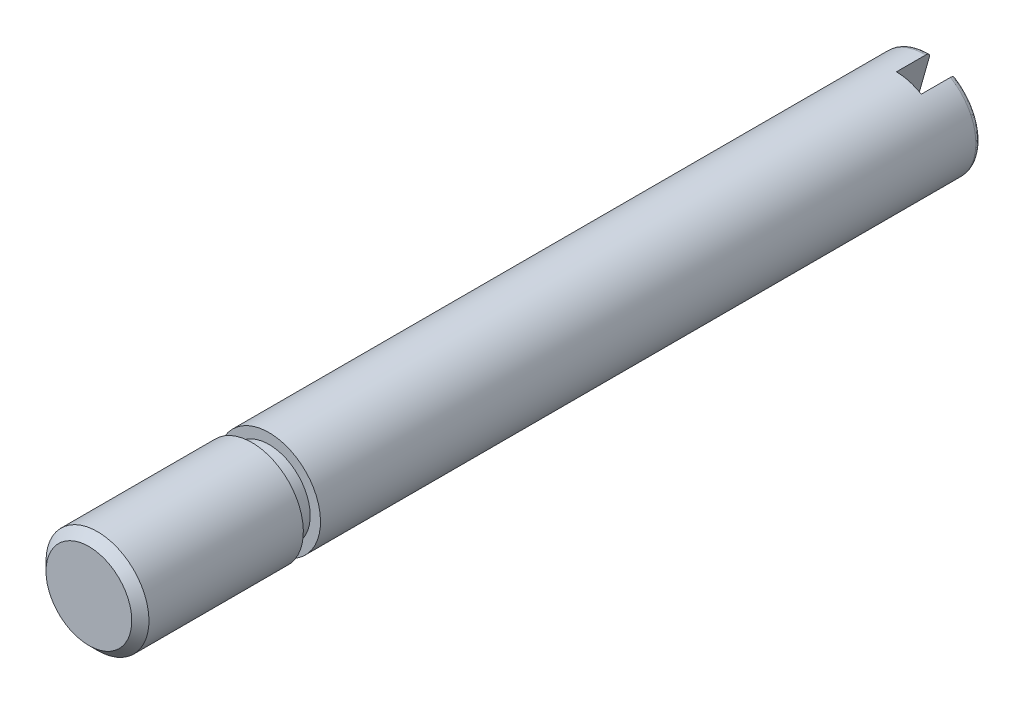
ISO-10303-21;
HEADER;
FILE_DESCRIPTION(('STEP AP214'),'2;1');
FILE_NAME('part.step','',(''),(''),'','','');
FILE_SCHEMA(('AUTOMOTIVE_DESIGN { 1 0 10303 214 1 1 1 1 }'));
ENDSEC;
DATA;
#1=APPLICATION_CONTEXT('core data for automotive mechanical design processes');
#2=APPLICATION_PROTOCOL_DEFINITION('international standard','automotive_design',2000,#1);
#3=PRODUCT_CONTEXT('',#1,'mechanical');
#4=PRODUCT('Part','Part','',(#3));
#5=PRODUCT_RELATED_PRODUCT_CATEGORY('part','',(#4));
#6=PRODUCT_DEFINITION_FORMATION('','',#4);
#7=PRODUCT_DEFINITION_CONTEXT('part definition',#1,'design');
#8=PRODUCT_DEFINITION('design','',#6,#7);
#9=PRODUCT_DEFINITION_SHAPE('','',#8);
#10=(LENGTH_UNIT() NAMED_UNIT(*) SI_UNIT(.MILLI.,.METRE.));
#11=(NAMED_UNIT(*) PLANE_ANGLE_UNIT() SI_UNIT($,.RADIAN.));
#12=(NAMED_UNIT(*) SI_UNIT($,.STERADIAN.) SOLID_ANGLE_UNIT());
#13=UNCERTAINTY_MEASURE_WITH_UNIT(LENGTH_MEASURE(1.E-05),#10,'distance_accuracy_value','');
#14=(GEOMETRIC_REPRESENTATION_CONTEXT(3) GLOBAL_UNCERTAINTY_ASSIGNED_CONTEXT((#13)) GLOBAL_UNIT_ASSIGNED_CONTEXT((#10,
#11,#12)) REPRESENTATION_CONTEXT('',''));
#15=CARTESIAN_POINT('',(0.,0.,0.));
#16=DIRECTION('',(0.,0.,1.));
#17=DIRECTION('',(1.,0.,0.));
#18=AXIS2_PLACEMENT_3D('',#15,#16,#17);
#19=CARTESIAN_POINT('',(14.3275995278251,31.5094332973037,1.3));
#20=CARTESIAN_POINT('',(13.9351903412547,30.1307446996921,1.3));
#21=CARTESIAN_POINT('',(14.4744906158238,28.8026172838396,1.3));
#22=CARTESIAN_POINT('',(15.7169898798209,28.087800665499,1.3));
#23=CARTESIAN_POINT('',(14.327599527825,31.5094332973037,1.12426406871192));
#24=CARTESIAN_POINT('',(13.9351903412547,30.130744699692,1.12426406871192));
#25=CARTESIAN_POINT('',(14.4744906158238,28.8026172838395,1.12426406871192));
#26=CARTESIAN_POINT('',(15.7169898798209,28.087800665499,1.12426406871192));
#27=CARTESIAN_POINT('',(14.4471167357505,31.4754157168114,0.999999999999985));
#28=CARTESIAN_POINT('',(14.0709616698879,30.1538342707417,0.999999999999985));
#29=CARTESIAN_POINT('',(14.5879233956651,28.8807196937097,0.999999999999985));
#30=CARTESIAN_POINT('',(15.7789566550236,28.1955117491618,0.999999999999985));
#31=CARTESIAN_POINT('',(14.6161395921356,31.42730759312,1.));
#32=CARTESIAN_POINT('',(14.2629713242223,30.1864878552694,0.999999999999993));
#33=CARTESIAN_POINT('',(14.7483415713344,28.9911731810022,0.999999999999993));
#34=CARTESIAN_POINT('',(15.8665909089318,28.3478382244957,1.));
#35=(BOUNDED_SURFACE() B_SPLINE_SURFACE(3,3,((#19,#20,#21,#22),(#23,#24,#25,#26),(#27,#28,#29,
#30),(#31,#32,#33,#34)),.UNSPECIFIED.,.F.,.F.,.F.) B_SPLINE_SURFACE_WITH_KNOTS((4,4),(4,4),(0.,
1.),(0.,1.),.UNSPECIFIED.) GEOMETRIC_REPRESENTATION_ITEM() RATIONAL_B_SPLINE_SURFACE(((1.,
0.858761137665014,0.858761137665014,1.),(0.804737854124366,0.691077595129943,0.691077595129943,
0.804737854124366),(0.804737854124366,0.691077595129943,0.691077595129943,0.804737854124366),
(1.,0.858761137665014,0.858761137665014,1.))) REPRESENTATION_ITEM('') SURFACE());
#36=CARTESIAN_POINT('',(17.2130001709302,30.6881762554658,1.3));
#37=DIRECTION('',(0.,0.,1.));
#38=DIRECTION('',(-0.961800214368381,0.273752347279319,0.));
#39=AXIS2_PLACEMENT_3D('',#36,#37,#38);
#40=CIRCLE('',#39,3.);
#41=CARTESIAN_POINT('',(14.327599527825,31.5094332973037,1.3));
#42=VERTEX_POINT('',#41);
#43=CARTESIAN_POINT('',(15.6964712986554,28.0997133564547,1.3));
#44=VERTEX_POINT('',#43);
#45=EDGE_CURVE('E11',#42,#44,#40,.T.);
#46=CARTESIAN_POINT('',(14.6161395921356,31.42730759312,1.3));
#47=DIRECTION('',(-0.273752347279324,-0.96180021436838,0.));
#48=DIRECTION('',(-0.96180021436838,0.273752347279323,0.));
#49=AXIS2_PLACEMENT_3D('',#46,#47,#48);
#50=CIRCLE('',#49,0.3);
#51=CARTESIAN_POINT('',(14.6161395921356,31.42730759312,1.));
#52=VERTEX_POINT('',#51);
#53=EDGE_CURVE('E138',#42,#52,#50,.T.);
#54=CARTESIAN_POINT('',(14.6161395921356,31.42730759312,1.));
#55=CARTESIAN_POINT('',(14.274293320927,30.2262665054469,1.));
#56=CARTESIAN_POINT('',(14.7227896712529,29.0608440107428,1.));
#57=CARTESIAN_POINT('',(15.7816069207893,28.3988284523893,1.));
#58=(BOUNDED_CURVE() B_SPLINE_CURVE(3,(#54,#55,#56,#57),.UNSPECIFIED.,.F.,
.F.) B_SPLINE_CURVE_WITH_KNOTS((4,4),(0.5,1.),
.UNSPECIFIED.) CURVE() GEOMETRIC_REPRESENTATION_ITEM() RATIONAL_B_SPLINE_CURVE((1.,
0.866203502590302,0.866203502590302,1.)) REPRESENTATION_ITEM(''));
#59=CARTESIAN_POINT('',(15.7816069207893,28.3988284523893,1.));
#60=VERTEX_POINT('',#59);
#61=EDGE_CURVE('E135',#52,#60,#58,.T.);
#62=CARTESIAN_POINT('',(15.7816069207893,28.3988284523893,1.));
#63=CARTESIAN_POINT('',(15.7806739513126,28.3955505889798,0.999999975549372));
#64=CARTESIAN_POINT('',(15.779736963955,28.3922738655346,1.0000535924963));
#65=CARTESIAN_POINT('',(15.7778661153499,28.3857564892972,1.00026724492291));
#66=CARTESIAN_POINT('',(15.7769323080403,28.3825157879103,1.00042627140245));
#67=CARTESIAN_POINT('',(15.7750711594981,28.3760764329799,1.00084764695042));
#68=CARTESIAN_POINT('',(15.7741438540253,28.3728776966133,1.00110888792764));
#69=CARTESIAN_POINT('',(15.7722988652095,28.3665280215372,1.00173103036324));
#70=CARTESIAN_POINT('',(15.7713811960235,28.3633769610159,1.00209073181243));
#71=CARTESIAN_POINT('',(15.7695584265132,28.3571280521949,1.00290566856719));
#72=CARTESIAN_POINT('',(15.7686533159423,28.3540300397627,1.0033596193892));
#73=CARTESIAN_POINT('',(15.7668584388943,28.3478924907782,1.00435843578288));
#74=CARTESIAN_POINT('',(15.7659686348125,28.3448527422397,1.00490194153651));
#75=CARTESIAN_POINT('',(15.7633469811428,28.3358999815334,1.00664746148284));
#76=CARTESIAN_POINT('',(15.7616211415771,28.3300106776378,1.00798326210272));
#77=CARTESIAN_POINT('',(15.7582584476163,28.318519913428,1.01096091090899));
#78=CARTESIAN_POINT('',(15.7566205842944,28.3129155593046,1.01259052056934));
#79=CARTESIAN_POINT('',(15.7534468980072,28.3020216035975,1.01610860228836));
#80=CARTESIAN_POINT('',(15.7519095996854,28.2967283123653,1.01798431006652));
#81=CARTESIAN_POINT('',(15.7489461873004,28.2864773246064,1.02194499013394));
#82=CARTESIAN_POINT('',(15.7475181666997,28.2815151598697,1.02401698118146));
#83=CARTESIAN_POINT('',(15.7447784676268,28.2719405165659,1.02831992765366));
#84=CARTESIAN_POINT('',(15.743464527409,28.2673228767809,1.03053796398403));
#85=CARTESIAN_POINT('',(15.7409545554435,28.2584452577589,1.03508337158106));
#86=CARTESIAN_POINT('',(15.7397560052497,28.2541795292839,1.03739812948116));
#87=CARTESIAN_POINT('',(15.7374752052448,28.2460081775351,1.04208920521931));
#88=CARTESIAN_POINT('',(15.7363902988765,28.2420963412999,1.04445341463916));
#89=CARTESIAN_POINT('',(15.7343325383685,28.2346304744177,1.04919838519865));
#90=CARTESIAN_POINT('',(15.7333570203152,28.2310698974215,1.05156769579987));
#91=CARTESIAN_POINT('',(15.7315116064823,28.2243003967519,1.05628129551688));
#92=CARTESIAN_POINT('',(15.7306391858849,28.2210847175099,1.05861489863373));
#93=CARTESIAN_POINT('',(15.7289921428727,28.2149957789976,1.06321932695368));
#94=CARTESIAN_POINT('',(15.7282152722382,28.2121156741087,1.06548029787352));
#95=CARTESIAN_POINT('',(15.7267497564522,28.2066868046289,1.06990583572401));
#96=CARTESIAN_POINT('',(15.7260593596351,28.2041311714747,1.07206140156628));
#97=CARTESIAN_POINT('',(15.7247587050448,28.1993379014812,1.07624630023692));
#98=CARTESIAN_POINT('',(15.7241471859581,28.1970935186153,1.07826750801592));
#99=CARTESIAN_POINT('',(15.7229890548223,28.1929118273929,1.08215872230218));
#100=CARTESIAN_POINT('',(15.7224425940486,28.190967608912,1.08402136231459));
#101=CARTESIAN_POINT('',(15.7208680125472,28.1854157244331,1.08949356132704));
#102=CARTESIAN_POINT('',(15.7198464708276,28.1818764060687,1.09317479643281));
#103=CARTESIAN_POINT('',(15.7178593112723,28.1749842442447,1.10072119688608));
#104=CARTESIAN_POINT('',(15.7168936880198,28.171631382724,1.10458634435135));
#105=CARTESIAN_POINT('',(15.715016028566,28.1651282970348,1.11248755749003));
#106=CARTESIAN_POINT('',(15.7141039255336,28.1619778196602,1.11652339868565));
#107=CARTESIAN_POINT('',(15.7123410764134,28.1558900313645,1.12474977000038));
#108=CARTESIAN_POINT('',(15.7114901845584,28.1529522139069,1.12893989409049));
#109=CARTESIAN_POINT('',(15.7098537798084,28.1472999441527,1.13745788237911));
#110=CARTESIAN_POINT('',(15.7090680390831,28.1445847138924,1.14178518648546));
#111=CARTESIAN_POINT('',(15.7075658447791,28.1393859018291,1.15055948438418));
#112=CARTESIAN_POINT('',(15.7068490737431,28.1369012607419,1.15500579616164));
#113=CARTESIAN_POINT('',(15.7054875869309,28.1321702953796,1.16399936927883));
#114=CARTESIAN_POINT('',(15.704842462889,28.1299226249404,1.16854586062327));
#115=CARTESIAN_POINT('',(15.7036261413333,28.1256704945771,1.17772057674804));
#116=CARTESIAN_POINT('',(15.7030544456596,28.1236644022347,1.18234797887762));
#117=CARTESIAN_POINT('',(15.7019858838606,28.1198985550817,1.19166509592119));
#118=CARTESIAN_POINT('',(15.7014884341495,28.1181368877245,1.19635397083938));
#119=CARTESIAN_POINT('',(15.7005683347952,28.1148612584183,1.20577466023028));
#120=CARTESIAN_POINT('',(15.7001450234409,28.1133451153553,1.21050565165603));
#121=CARTESIAN_POINT('',(15.6993722684342,28.11056019343,1.21999149289481));
#122=CARTESIAN_POINT('',(15.6990220949277,28.1092889813693,1.22474556887019));
#123=CARTESIAN_POINT('',(15.698393830271,28.1069919477784,1.23425901618843));
#124=CARTESIAN_POINT('',(15.6981149533542,28.1059634618091,1.23901769229128));
#125=CARTESIAN_POINT('',(15.6976267098402,28.1041483809549,1.24852250062447));
#126=CARTESIAN_POINT('',(15.6974165155427,28.1033589148507,1.25326804202533));
#127=CARTESIAN_POINT('',(15.6970623379982,28.1020169646595,1.2627296405014));
#128=CARTESIAN_POINT('',(15.6969175005685,28.1014614300359,1.26744523295149));
#129=CARTESIAN_POINT('',(15.6966901432559,28.1005812012751,1.27683105594817));
#130=CARTESIAN_POINT('',(15.6966067582321,28.1002533063526,1.28150096529322));
#131=CARTESIAN_POINT('',(15.6964977164326,28.0998210109607,1.29078067793812));
#132=CARTESIAN_POINT('',(15.6964712021069,28.0997132916635,1.29539031688364));
#133=CARTESIAN_POINT('',(15.6964712986554,28.0997133564547,1.3));
#134=B_SPLINE_CURVE_WITH_KNOTS('',3,(#62,#63,#64,#65,#66,#67,#68,#69,#70,#71,#72,#73,#74,#75,
#76,#77,#78,#79,#80,#81,#82,#83,#84,#85,#86,#87,#88,#89,#90,#91,#92,#93,#94,#95,#96,#97,#98,#99,
#100,#101,#102,#103,#104,#105,#106,#107,#108,#109,#110,#111,#112,#113,#114,#115,#116,#117,#118,
#119,#120,#121,#122,#123,#124,#125,#126,#127,#128,#129,#130,#131,#132,#133),.UNSPECIFIED.,.F.,
.F.,(4,2,2,2,2,2,2,2,2,2,2,2,2,2,2,2,2,2,2,2,2,2,2,2,2,2,2,2,2,2,2,2,2,2,2,4),(0.,
0.0102237352366994,0.0203509935103454,0.0303713771356298,0.0402746908777026,0.0500509853615911,
0.0596905969140439,0.0785207224399316,0.0966969585577286,0.114155391983707,0.130839033239317,
0.146698050819379,0.161689752206389,0.175778348185342,0.188934543814742,0.201135002199291,
0.212361726797937,0.222601405661014,0.231844758369286,0.240085925890713,0.255701874666598,
0.271316308157883,0.286910809598573,0.30246685289533,0.317965976395117,0.333389954944088,
0.348720967064951,0.363941754266164,0.37903576978509,0.393987314441675,0.408781657718994,
0.423405142668291,0.437845273735379,0.452090787097925,0.466131703568946,0.479959364542045),.UNSPECIFIED.);
#135=EDGE_CURVE('E193',#44,#60,#134,.F.);
#136=ORIENTED_EDGE('',*,*,#45,.F.);
#137=ORIENTED_EDGE('',*,*,#53,.T.);
#138=ORIENTED_EDGE('',*,*,#61,.T.);
#139=ORIENTED_EDGE('',*,*,#135,.F.);
#140=EDGE_LOOP('',(#136,#137,#138,#139));
#141=FACE_BOUND('',#140,.T.);
#142=ADVANCED_FACE('F17',(#141),#35,.T.);
#143=CARTESIAN_POINT('',(17.2130001709302,30.6881762554658,49.5));
#144=DIRECTION('',(0.,0.,-1.));
#145=DIRECTION('',(0.961800214368381,-0.27375234727932,0.));
#146=AXIS2_PLACEMENT_3D('',#143,#144,#145);
#147=CYLINDRICAL_SURFACE('',#146,3.);
#148=CARTESIAN_POINT('',(17.2130001709302,30.6881762554658,1.3));
#149=DIRECTION('',(0.,0.,-1.));
#150=DIRECTION('',(-0.961800214368381,0.273752347279319,0.));
#151=AXIS2_PLACEMENT_3D('',#148,#149,#150);
#152=CIRCLE('',#151,3.);
#153=CARTESIAN_POINT('',(18.729529043205,33.2766391544769,1.3));
#154=VERTEX_POINT('',#153);
#155=CARTESIAN_POINT('',(17.139171620208,27.6890848355357,1.3));
#156=VERTEX_POINT('',#155);
#157=EDGE_CURVE('E278',#154,#156,#152,.T.);
#158=ORIENTED_EDGE('',*,*,#157,.F.);
#159=DIRECTION('',(0.,0.,1.));
#160=VECTOR('',#159,1.);
#161=CARTESIAN_POINT('',(18.729529043205,33.2766391544769,50.));
#162=LINE('',#161,#160);
#163=CARTESIAN_POINT('',(18.729529043205,33.2766391544769,3.));
#164=VERTEX_POINT('',#163);
#165=EDGE_CURVE('E261',#154,#164,#162,.T.);
#166=ORIENTED_EDGE('',*,*,#165,.T.);
#167=CARTESIAN_POINT('',(17.2130001709302,30.6881762554658,3.));
#168=DIRECTION('',(0.,0.,-1.));
#169=DIRECTION('',(0.96180021436838,-0.27375234727932,0.));
#170=AXIS2_PLACEMENT_3D('',#167,#168,#169);
#171=CIRCLE('',#170,3.);
#172=CARTESIAN_POINT('',(17.2868287216524,33.6872676753959,3.));
#173=VERTEX_POINT('',#172);
#174=EDGE_CURVE('E334',#173,#164,#171,.T.);
#175=ORIENTED_EDGE('',*,*,#174,.F.);
#176=DIRECTION('',(0.,0.,1.));
#177=VECTOR('',#176,1.);
#178=CARTESIAN_POINT('',(17.2868287216524,33.6872676753959,1.));
#179=LINE('',#178,#177);
#180=CARTESIAN_POINT('',(17.2868287216524,33.6872676753959,1.3));
#181=VERTEX_POINT('',#180);
#182=EDGE_CURVE('E208',#181,#173,#179,.T.);
#183=ORIENTED_EDGE('',*,*,#182,.F.);
#184=CARTESIAN_POINT('',(17.2130001709302,30.6881762554658,1.3));
#185=DIRECTION('',(0.,0.,1.));
#186=DIRECTION('',(-0.96180021436838,0.273752347279321,0.));
#187=AXIS2_PLACEMENT_3D('',#184,#185,#186);
#188=CIRCLE('',#187,3.);
#189=EDGE_CURVE('E342',#181,#42,#188,.T.);
#190=ORIENTED_EDGE('',*,*,#189,.T.);
#191=ORIENTED_EDGE('',*,*,#45,.T.);
#192=DIRECTION('',(0.,0.,-1.));
#193=VECTOR('',#192,1.);
#194=CARTESIAN_POINT('',(15.6964712986554,28.0997133564547,1.));
#195=LINE('',#194,#193);
#196=CARTESIAN_POINT('',(15.6964712986554,28.0997133564547,3.));
#197=VERTEX_POINT('',#196);
#198=EDGE_CURVE('E204',#197,#44,#195,.T.);
#199=ORIENTED_EDGE('',*,*,#198,.F.);
#200=CARTESIAN_POINT('',(17.2130001709302,30.6881762554658,3.));
#201=DIRECTION('',(0.,0.,-1.));
#202=DIRECTION('',(0.96180021436838,-0.27375234727932,0.));
#203=AXIS2_PLACEMENT_3D('',#200,#201,#202);
#204=CIRCLE('',#203,3.);
#205=CARTESIAN_POINT('',(17.139171620208,27.6890848355357,3.));
#206=VERTEX_POINT('',#205);
#207=EDGE_CURVE('E320',#206,#197,#204,.T.);
#208=ORIENTED_EDGE('',*,*,#207,.F.);
#209=DIRECTION('',(0.,0.,-1.));
#210=VECTOR('',#209,1.);
#211=CARTESIAN_POINT('',(17.139171620208,27.6890848355357,50.));
#212=LINE('',#211,#210);
#213=EDGE_CURVE('E269',#206,#156,#212,.T.);
#214=ORIENTED_EDGE('',*,*,#213,.T.);
#215=EDGE_LOOP('',(#158,#166,#175,#183,#190,#191,#199,#208,#214));
#216=FACE_BOUND('',#215,.T.);
#217=CARTESIAN_POINT('',(17.2130001709302,30.6881762554658,39.5000000033493));
#218=DIRECTION('',(0.,0.,1.));
#219=DIRECTION('',(-0.961800214368381,0.273752347279319,0.));
#220=AXIS2_PLACEMENT_3D('',#217,#218,#219);
#221=CIRCLE('',#220,3.);
#222=CARTESIAN_POINT('',(14.3275995278251,31.5094332973037,39.5000000033493));
#223=VERTEX_POINT('',#222);
#224=EDGE_CURVE('E126',#223,#223,#221,.T.);
#225=ORIENTED_EDGE('',*,*,#224,.F.);
#226=EDGE_LOOP('',(#225));
#227=FACE_BOUND('',#226,.T.);
#228=ADVANCED_FACE('F19',(#216,#227),#147,.T.);
#229=CARTESIAN_POINT('',(17.2130001709302,30.6881762554658,49.5));
#230=DIRECTION('',(0.,0.,1.));
#231=DIRECTION('',(-0.96180021436838,0.27375234727932,0.));
#232=AXIS2_PLACEMENT_3D('',#229,#230,#231);
#233=CYLINDRICAL_SURFACE('',#232,2.4);
#234=CARTESIAN_POINT('',(17.2130001709302,30.6881762554658,40.5000000033493));
#235=DIRECTION('',(0.,0.,1.));
#236=DIRECTION('',(-0.96180021436838,0.27375234727932,0.));
#237=AXIS2_PLACEMENT_3D('',#234,#235,#236);
#238=CIRCLE('',#237,2.4);
#239=CARTESIAN_POINT('',(14.9046796564461,31.3451818889361,40.5000000033493));
#240=VERTEX_POINT('',#239);
#241=EDGE_CURVE('E133',#240,#240,#238,.T.);
#242=ORIENTED_EDGE('',*,*,#241,.F.);
#243=EDGE_LOOP('',(#242));
#244=FACE_BOUND('',#243,.T.);
#245=CARTESIAN_POINT('',(17.2130001709302,30.6881762554658,39.5000000033493));
#246=DIRECTION('',(0.,0.,1.));
#247=DIRECTION('',(-0.96180021436838,0.27375234727932,0.));
#248=AXIS2_PLACEMENT_3D('',#245,#246,#247);
#249=CIRCLE('',#248,2.4);
#250=CARTESIAN_POINT('',(14.9046796564461,31.3451818889361,39.5000000033493));
#251=VERTEX_POINT('',#250);
#252=EDGE_CURVE('E121',#251,#251,#249,.T.);
#253=ORIENTED_EDGE('',*,*,#252,.T.);
#254=EDGE_LOOP('',(#253));
#255=FACE_BOUND('',#254,.T.);
#256=ADVANCED_FACE('F122',(#244,#255),#233,.T.);
#257=CARTESIAN_POINT('',(17.2130001709302,30.6881762554658,50.0000000033494));
#258=DIRECTION('',(0.,0.,-1.));
#259=DIRECTION('',(0.273752347279319,0.961800214368381,0.));
#260=AXIS2_PLACEMENT_3D('',#257,#258,#259);
#261=CONICAL_SURFACE('',#260,2.50000000334937,0.78539815);
#262=CARTESIAN_POINT('',(17.2130001709302,30.6881762554658,50.0000000033494));
#263=DIRECTION('',(0.,0.,-1.));
#264=DIRECTION('',(0.273752347279319,0.961800214368381,0.));
#265=AXIS2_PLACEMENT_3D('',#262,#263,#264);
#266=CIRCLE('',#265,2.50000000334937);
#267=CARTESIAN_POINT('',(17.8973810400454,33.0926767946081,50.0000000033494));
#268=VERTEX_POINT('',#267);
#269=EDGE_CURVE('E46',#268,#268,#266,.T.);
#270=ORIENTED_EDGE('',*,*,#269,.T.);
#271=EDGE_LOOP('',(#270));
#272=FACE_BOUND('',#271,.T.);
#273=CARTESIAN_POINT('',(17.2130001709302,30.6881762554658,49.5));
#274=DIRECTION('',(0.,0.,-1.));
#275=DIRECTION('',(-0.961800214368381,0.273752347279319,0.));
#276=AXIS2_PLACEMENT_3D('',#273,#274,#275);
#277=CIRCLE('',#276,3.);
#278=CARTESIAN_POINT('',(14.3275995278251,31.5094332973037,49.5));
#279=VERTEX_POINT('',#278);
#280=EDGE_CURVE('E27',#279,#279,#277,.T.);
#281=ORIENTED_EDGE('',*,*,#280,.F.);
#282=EDGE_LOOP('',(#281));
#283=FACE_BOUND('',#282,.T.);
#284=ADVANCED_FACE('F399',(#272,#283),#261,.T.);
#285=CARTESIAN_POINT('',(17.2130001709302,30.6881762554658,49.5));
#286=DIRECTION('',(0.,0.,-1.));
#287=DIRECTION('',(0.961800214368381,-0.27375234727932,0.));
#288=AXIS2_PLACEMENT_3D('',#285,#286,#287);
#289=CYLINDRICAL_SURFACE('',#288,3.);
#290=CARTESIAN_POINT('',(17.2130001709302,30.6881762554658,40.5000000033493));
#291=DIRECTION('',(0.,0.,1.));
#292=DIRECTION('',(-0.961800214368381,0.273752347279319,0.));
#293=AXIS2_PLACEMENT_3D('',#290,#291,#292);
#294=CIRCLE('',#293,3.);
#295=CARTESIAN_POINT('',(14.3275995278251,31.5094332973037,40.5000000033493));
#296=VERTEX_POINT('',#295);
#297=EDGE_CURVE('E125',#296,#296,#294,.T.);
#298=ORIENTED_EDGE('',*,*,#297,.T.);
#299=EDGE_LOOP('',(#298));
#300=FACE_BOUND('',#299,.T.);
#301=ORIENTED_EDGE('',*,*,#280,.T.);
#302=EDGE_LOOP('',(#301));
#303=FACE_BOUND('',#302,.T.);
#304=ADVANCED_FACE('F402',(#300,#303),#289,.T.);
#305=CARTESIAN_POINT('',(17.2130001709302,30.6881762554658,50.));
#306=DIRECTION('',(0.,0.,1.));
#307=DIRECTION('',(0.,-1.,0.));
#308=AXIS2_PLACEMENT_3D('',#305,#306,#307);
#309=PLANE('',#308);
#310=ORIENTED_EDGE('',*,*,#269,.F.);
#311=EDGE_LOOP('',(#310));
#312=FACE_BOUND('',#311,.T.);
#313=ADVANCED_FACE('F403',(#312),#309,.T.);
#314=CARTESIAN_POINT('',(20.0984008140353,29.8669192136278,40.5000000033493));
#315=DIRECTION('',(0.,0.,-1.));
#316=DIRECTION('',(0.,-1.,0.));
#317=AXIS2_PLACEMENT_3D('',#314,#315,#316);
#318=PLANE('',#317);
#319=ORIENTED_EDGE('',*,*,#241,.T.);
#320=EDGE_LOOP('',(#319));
#321=FACE_BOUND('',#320,.T.);
#322=ORIENTED_EDGE('',*,*,#297,.F.);
#323=EDGE_LOOP('',(#322));
#324=FACE_BOUND('',#323,.T.);
#325=ADVANCED_FACE('F398',(#321,#324),#318,.T.);
#326=CARTESIAN_POINT('',(19.5213206854143,30.0311706219955,39.5000000033493));
#327=DIRECTION('',(0.,0.,1.));
#328=DIRECTION('',(0.,-1.,0.));
#329=AXIS2_PLACEMENT_3D('',#326,#327,#328);
#330=PLANE('',#329);
#331=ORIENTED_EDGE('',*,*,#252,.F.);
#332=EDGE_LOOP('',(#331));
#333=FACE_BOUND('',#332,.T.);
#334=ORIENTED_EDGE('',*,*,#224,.T.);
#335=EDGE_LOOP('',(#334));
#336=FACE_BOUND('',#335,.T.);
#337=ADVANCED_FACE('F394',(#333,#336),#330,.T.);
#338=CARTESIAN_POINT('',(17.2130001709302,30.6881762554658,1.));
#339=DIRECTION('',(0.,0.,-1.));
#340=DIRECTION('',(0.,-1.,0.));
#341=AXIS2_PLACEMENT_3D('',#338,#339,#340);
#342=PLANE('',#341);
#343=CARTESIAN_POINT('',(17.2016930995185,33.3881525794612,1.));
#344=CARTESIAN_POINT('',(15.9529612548662,33.3829230891076,0.999999999999993));
#345=CARTESIAN_POINT('',(14.9579858633441,32.628348680793,0.999999999999993));
#346=CARTESIAN_POINT('',(14.6161395921356,31.42730759312,1.));
#347=(BOUNDED_CURVE() B_SPLINE_CURVE(3,(#343,#344,#345,#346),.UNSPECIFIED.,.F.,
.F.) B_SPLINE_CURVE_WITH_KNOTS((4,4),(0.,0.5),
.UNSPECIFIED.) CURVE() GEOMETRIC_REPRESENTATION_ITEM() RATIONAL_B_SPLINE_CURVE((1.,
0.866203502590302,0.866203502590302,1.)) REPRESENTATION_ITEM(''));
#348=CARTESIAN_POINT('',(17.2016930995185,33.3881525794612,1.));
#349=VERTEX_POINT('',#348);
#350=EDGE_CURVE('E213',#349,#52,#347,.T.);
#351=ORIENTED_EDGE('',*,*,#350,.F.);
#352=DIRECTION('',(-0.27375234727932,-0.961800214368381,0.));
#353=VECTOR('',#352,1.);
#354=CARTESIAN_POINT('',(16.4916500101539,30.8934905159253,1.));
#355=LINE('',#354,#353);
#356=EDGE_CURVE('E349',#349,#60,#355,.T.);
#357=ORIENTED_EDGE('',*,*,#356,.T.);
#358=ORIENTED_EDGE('',*,*,#61,.F.);
#359=EDGE_LOOP('',(#351,#357,#358));
#360=FACE_BOUND('',#359,.T.);
#361=ADVANCED_FACE('F391',(#360),#342,.T.);
#362=CARTESIAN_POINT('',(17.2130001709302,30.6881762554658,1.));
#363=DIRECTION('',(0.,0.,-1.));
#364=DIRECTION('',(0.,-1.,0.));
#365=AXIS2_PLACEMENT_3D('',#362,#363,#364);
#366=PLANE('',#365);
#367=CARTESIAN_POINT('',(17.2243072423419,27.9881999314703,1.));
#368=CARTESIAN_POINT('',(20.5590897467165,28.002165470199,0.999999999999992));
#369=CARTESIAN_POINT('',(21.4720022901852,31.2095881233167,0.999999999999992));
#370=CARTESIAN_POINT('',(18.644393421071,32.9775240585423,1.));
#371=(BOUNDED_CURVE() B_SPLINE_CURVE(3,(#367,#368,#369,#370),.UNSPECIFIED.,.F.,
.F.) B_SPLINE_CURVE_WITH_KNOTS((4,4),(0.,1.),
.UNSPECIFIED.) CURVE() GEOMETRIC_REPRESENTATION_ITEM() RATIONAL_B_SPLINE_CURVE((1.,
0.518518518518519,0.518518518518519,1.)) REPRESENTATION_ITEM(''));
#372=CARTESIAN_POINT('',(17.2243072423419,27.9881999314703,1.));
#373=VERTEX_POINT('',#372);
#374=CARTESIAN_POINT('',(18.644393421071,32.9775240585423,1.));
#375=VERTEX_POINT('',#374);
#376=EDGE_CURVE('E268',#373,#375,#371,.T.);
#377=ORIENTED_EDGE('',*,*,#376,.F.);
#378=DIRECTION('',(0.27375234727932,0.961800214368381,0.));
#379=VECTOR('',#378,1.);
#380=CARTESIAN_POINT('',(17.9343503317065,30.4828619950063,1.));
#381=LINE('',#380,#379);
#382=EDGE_CURVE('E286',#373,#375,#381,.T.);
#383=ORIENTED_EDGE('',*,*,#382,.T.);
#384=EDGE_LOOP('',(#377,#383));
#385=FACE_BOUND('',#384,.T.);
#386=ADVANCED_FACE('F382',(#385),#366,.T.);
#387=CARTESIAN_POINT('',(17.3105450691166,33.6865900015719,1.3));
#388=CARTESIAN_POINT('',(15.877857080862,33.7331984471636,1.3));
#389=CARTESIAN_POINT('',(14.7200087143954,32.8881218949155,1.3));
#390=CARTESIAN_POINT('',(14.3275995278251,31.5094332973037,1.3));
#391=CARTESIAN_POINT('',(17.3105450691166,33.6865900015718,1.12426406871192));
#392=CARTESIAN_POINT('',(15.877857080862,33.7331984471637,1.12426406871192));
#393=CARTESIAN_POINT('',(14.7200087143953,32.8881218949154,1.12426406871192));
#394=CARTESIAN_POINT('',(14.3275995278251,31.5094332973037,1.12426406871192));
#395=CARTESIAN_POINT('',(17.3065046271396,33.5623916376475,1.));
#396=CARTESIAN_POINT('',(15.9331605184235,33.6070694982109,0.999999999999986));
#397=CARTESIAN_POINT('',(14.823271801613,32.7969971628811,0.999999999999986));
#398=CARTESIAN_POINT('',(14.4471167357505,31.4754157168114,1.));
#399=CARTESIAN_POINT('',(17.3007905792979,33.3867486269613,1.));
#400=CARTESIAN_POINT('',(16.0113713898688,33.4286962279939,0.999999999999993));
#401=CARTESIAN_POINT('',(14.9693078600488,32.6681273309705,0.999999999999993));
#402=CARTESIAN_POINT('',(14.6161395921356,31.42730759312,1.));
#403=(BOUNDED_SURFACE() B_SPLINE_SURFACE(3,3,((#387,#388,#389,#390),(#391,#392,#393,#394),(#395,
#396,#397,#398),(#399,#400,#401,#402)),.UNSPECIFIED.,.F.,.F.,
.F.) B_SPLINE_SURFACE_WITH_KNOTS((4,4),(4,4),(0.,1.),(0.,1.),
.UNSPECIFIED.) GEOMETRIC_REPRESENTATION_ITEM() RATIONAL_B_SPLINE_SURFACE(((1.,0.858761137665013,
0.858761137665013,1.),(0.804737854124366,0.691077595129942,0.691077595129942,0.804737854124366),
(0.804737854124366,0.691077595129942,0.691077595129942,0.804737854124366),(1.,0.858761137665013,
0.858761137665013,1.))) REPRESENTATION_ITEM('') SURFACE());
#404=CARTESIAN_POINT('',(17.2868287216524,33.6872676753959,1.3));
#405=CARTESIAN_POINT('',(17.2868286751652,33.6872677844142,1.29534953643709));
#406=CARTESIAN_POINT('',(17.2867944125154,33.6871603581475,1.29069911518827));
#407=CARTESIAN_POINT('',(17.2866590578579,33.6867280296808,1.28134163350334));
#408=CARTESIAN_POINT('',(17.2865570022935,33.6863999910182,1.2766347316143));
#409=CARTESIAN_POINT('',(17.2862859685966,33.6855180543744,1.26717928587066));
#410=CARTESIAN_POINT('',(17.2861160970131,33.6849611380075,1.26243104921547));
#411=CARTESIAN_POINT('',(17.2857093841287,33.6836144791262,1.2529090365217));
#412=CARTESIAN_POINT('',(17.2854717205949,33.6828218726305,1.24813570063563));
#413=CARTESIAN_POINT('',(17.2849295185385,33.6809982498079,1.23858061512918));
#414=CARTESIAN_POINT('',(17.2846242309162,33.679964555469,1.23379941913662));
#415=CARTESIAN_POINT('',(17.283946999107,33.6776547715843,1.2242465908936));
#416=CARTESIAN_POINT('',(17.283574380127,33.6763762195064,1.21947560191668));
#417=CARTESIAN_POINT('',(17.2827628378758,33.6735744561492,1.20996183451156));
#418=CARTESIAN_POINT('',(17.2823233149612,33.6720490234146,1.20521976146956));
#419=CARTESIAN_POINT('',(17.2813784506215,33.6687530733928,1.19578293046102));
#420=CARTESIAN_POINT('',(17.2808725851374,33.666980596782,1.19108890932209));
#421=CARTESIAN_POINT('',(17.2797956527298,33.6631920542031,1.18176751374457));
#422=CARTESIAN_POINT('',(17.2792241373931,33.6611743067469,1.17714087456929));
#423=CARTESIAN_POINT('',(17.2780166535823,33.6568986862276,1.1679735545054));
#424=CARTESIAN_POINT('',(17.2773803120887,33.6546394192739,1.16343357290024));
#425=CARTESIAN_POINT('',(17.2760440317974,33.6498862061674,1.15445860664933));
#426=CARTESIAN_POINT('',(17.2753437947149,33.6473911571557,1.15002425054777));
#427=CARTESIAN_POINT('',(17.273880739249,33.6421737694076,1.14127903291632));
#428=CARTESIAN_POINT('',(17.2731176966586,33.6394506156978,1.13696869513919));
#429=CARTESIAN_POINT('',(17.2715299593577,33.6337863266355,1.12848925507763));
#430=CARTESIAN_POINT('',(17.2707051128436,33.6308446547191,1.12432053970693));
#431=CARTESIAN_POINT('',(17.2689954752796,33.6247542872239,1.11614094509131));
#432=CARTESIAN_POINT('',(17.2681106048009,33.6216053175005,1.11213028654274));
#433=CARTESIAN_POINT('',(17.2662800965333,33.6151134271053,1.10428257364725));
#434=CARTESIAN_POINT('',(17.2653344484663,33.6117704736384,1.10044554885128));
#435=CARTESIAN_POINT('',(17.2633913138271,33.6049033589888,1.09295785734833));
#436=CARTESIAN_POINT('',(17.2623938796433,33.6013793809732,1.08930700943645));
#437=CARTESIAN_POINT('',(17.2607934441035,33.5958166005689,1.08382920825054));
#438=CARTESIAN_POINT('',(17.2602191464306,33.5938372215695,1.08193310291858));
#439=CARTESIAN_POINT('',(17.2589739196174,33.589598194956,1.07798250644119));
#440=CARTESIAN_POINT('',(17.2582995277477,33.5873327622561,1.07593530024076));
#441=CARTESIAN_POINT('',(17.2568582346139,33.5825059406233,1.071706003971));
#442=CARTESIAN_POINT('',(17.2560889921898,33.5799382222876,1.06953194062823));
#443=CARTESIAN_POINT('',(17.2544573934995,33.5744923656676,1.06507683661428));
#444=CARTESIAN_POINT('',(17.253593032543,33.571607572277,1.06280466075699));
#445=CARTESIAN_POINT('',(17.2517725999537,33.5655141396248,1.0581849714598));
#446=CARTESIAN_POINT('',(17.2508149194031,33.562298639936,1.05584713834391));
#447=CARTESIAN_POINT('',(17.2488091057589,33.5555325693924,1.05113177117535));
#448=CARTESIAN_POINT('',(17.247759626985,33.5519750979102,1.04876470684595));
#449=CARTESIAN_POINT('',(17.2455719770302,33.5445168988735,1.0440302836398));
#450=CARTESIAN_POINT('',(17.2444326725255,33.5406093971858,1.04167411509845));
#451=CARTESIAN_POINT('',(17.2420674155584,33.5324469948099,1.03700433950855));
#452=CARTESIAN_POINT('',(17.2408404881381,33.5281856204351,1.03470253653965));
#453=CARTESIAN_POINT('',(17.2383023502198,33.5193163257374,1.03018722043731));
#454=CARTESIAN_POINT('',(17.2369902836338,33.5147024022857,1.02798597447284));
#455=CARTESIAN_POINT('',(17.2342845013611,33.5051347726553,1.02371956276908));
#456=CARTESIAN_POINT('',(17.2328900156491,33.500175691891,1.0216669330912));
#457=CARTESIAN_POINT('',(17.2300222392571,33.4899311368104,1.01774653725719));
#458=CARTESIAN_POINT('',(17.2285482381411,33.4846410477096,1.01589134056476));
#459=CARTESIAN_POINT('',(17.2255244670049,33.4737552374966,1.01241432693503));
#460=CARTESIAN_POINT('',(17.2239740280935,33.4681557649144,1.01080484479375));
#461=CARTESIAN_POINT('',(17.2208003218589,33.4566788300848,1.00786592072196));
#462=CARTESIAN_POINT('',(17.2191764077674,33.4507985069378,1.00654828403067));
#463=CARTESIAN_POINT('',(17.2167066127589,33.4418628668683,1.00482718094789));
#464=CARTESIAN_POINT('',(17.21586807323,33.4388303802553,1.004291523286));
#465=CARTESIAN_POINT('',(17.2141738146254,33.4327096760729,1.00330738790436));
#466=CARTESIAN_POINT('',(17.2133180183652,33.4296212678674,1.00286021871009));
#467=CARTESIAN_POINT('',(17.2115896423488,33.4233944199657,1.00205765067708));
#468=CARTESIAN_POINT('',(17.2107169873568,33.4202558423278,1.00170348700398));
#469=CARTESIAN_POINT('',(17.2089552257431,33.4139345708657,1.00109105923047));
#470=CARTESIAN_POINT('',(17.2080660454592,33.4107517857318,1.00083394831951));
#471=CARTESIAN_POINT('',(17.206271562555,33.4043484002585,1.00041931928639));
#472=CARTESIAN_POINT('',(17.2053661884506,33.4011277510649,1.00026286538037));
#473=CARTESIAN_POINT('',(17.2035396108628,33.3946552249141,1.00005270965059));
#474=CARTESIAN_POINT('',(17.2026183384662,33.3914033359257,0.999999976337503));
#475=CARTESIAN_POINT('',(17.2016930995185,33.3881525794613,1.));
#476=B_SPLINE_CURVE_WITH_KNOTS('',3,(#404,#405,#406,#407,#408,#409,#410,#411,#412,#413,#414,
#415,#416,#417,#418,#419,#420,#421,#422,#423,#424,#425,#426,#427,#428,#429,#430,#431,#432,#433,
#434,#435,#436,#437,#438,#439,#440,#441,#442,#443,#444,#445,#446,#447,#448,#449,#450,#451,#452,
#453,#454,#455,#456,#457,#458,#459,#460,#461,#462,#463,#464,#465,#466,#467,#468,#469,#470,#471,
#472,#473,#474,#475),.UNSPECIFIED.,.F.,.F.,(4,2,2,2,2,2,2,2,2,2,2,2,2,2,2,2,2,2,2,2,2,2,2,2,2,2,
2,2,2,2,2,2,2,2,2,4),(0.,0.0139499725281683,0.0281025872065851,0.0424481584712892,
0.0569757160778702,0.0716730556172473,0.0865268062753298,0.101522515938747,0.116644753294693,
0.131877226089503,0.147202914218435,0.162604215841559,0.178063104280304,0.19356129307155,
0.209080406259298,0.224602150806581,0.240108487923106,0.248509097746024,0.257888452021988,
0.268240418235647,0.279555473362914,0.291820113967907,0.305016232524453,0.319120497178696,
0.334103773227357,0.349930627095721,0.366558955600402,0.383939783346914,0.402017268130275,
0.420728947403354,0.4303024640306,0.440008417327972,0.449837406399154,0.459779760034414,
0.46982557497284,0.479964757480711),.UNSPECIFIED.);
#477=EDGE_CURVE('E151',#349,#181,#476,.F.);
#478=ORIENTED_EDGE('',*,*,#53,.F.);
#479=ORIENTED_EDGE('',*,*,#189,.F.);
#480=ORIENTED_EDGE('',*,*,#477,.F.);
#481=ORIENTED_EDGE('',*,*,#350,.T.);
#482=EDGE_LOOP('',(#478,#479,#480,#481));
#483=FACE_BOUND('',#482,.T.);
#484=ADVANCED_FACE('F168',(#483),#403,.T.);
#485=CARTESIAN_POINT('',(15.3658084098113,26.9379639119851,1.));
#486=DIRECTION('',(0.961800214368381,-0.27375234727932,0.));
#487=DIRECTION('',(0.,0.,-1.));
#488=AXIS2_PLACEMENT_3D('',#485,#486,#487);
#489=PLANE('',#488);
#490=ORIENTED_EDGE('',*,*,#135,.T.);
#491=ORIENTED_EDGE('',*,*,#356,.F.);
#492=ORIENTED_EDGE('',*,*,#477,.T.);
#493=ORIENTED_EDGE('',*,*,#182,.T.);
#494=DIRECTION('',(0.27375234727932,0.961800214368381,0.));
#495=VECTOR('',#494,1.);
#496=CARTESIAN_POINT('',(15.9287292099825,28.9157272139552,3.));
#497=LINE('',#496,#495);
#498=EDGE_CURVE('E315',#197,#173,#497,.T.);
#499=ORIENTED_EDGE('',*,*,#498,.F.);
#500=ORIENTED_EDGE('',*,*,#198,.T.);
#501=EDGE_LOOP('',(#490,#491,#492,#493,#499,#500));
#502=FACE_BOUND('',#501,.T.);
#503=ADVANCED_FACE('F157',(#502),#489,.T.);
#504=CARTESIAN_POINT('',(17.0917450264354,27.6906277254277,1.3));
#505=CARTESIAN_POINT('',(21.0580376242239,27.5301854916376,1.29999999999998));
#506=CARTESIAN_POINT('',(22.1447075123949,31.348086385558,1.29999999999999));
#507=CARTESIAN_POINT('',(18.6883983096891,33.3003018902979,1.3));
#508=CARTESIAN_POINT('',(17.0917450264354,27.6906277254277,1.12426406871192));
#509=CARTESIAN_POINT('',(21.0580376242239,27.5301854916376,1.12426406871192));
#510=CARTESIAN_POINT('',(22.144707512395,31.348086385558,1.12426406871192));
#511=CARTESIAN_POINT('',(18.6883983096891,33.3003018902978,1.12426406871193));
#512=CARTESIAN_POINT('',(17.0967675789711,27.814790250929,0.999999999999994));
#513=CARTESIAN_POINT('',(20.8987709581253,27.6609937520603,0.999999999999992));
#514=CARTESIAN_POINT('',(21.940429505746,31.3207520129748,1.));
#515=CARTESIAN_POINT('',(18.6272853177917,33.1921041038409,1.));
#516=CARTESIAN_POINT('',(17.1038705408849,27.9903825784315,1.));
#517=CARTESIAN_POINT('',(20.6735338788946,27.8459845680205,0.999999999999986));
#518=CARTESIAN_POINT('',(21.6515367782485,31.2820953725488,0.999999999999986));
#519=CARTESIAN_POINT('',(18.5408584958132,33.0390893268146,1.));
#520=(BOUNDED_SURFACE() B_SPLINE_SURFACE(3,3,((#504,#505,#506,#507),(#508,#509,#510,#511),(#512,
#513,#514,#515),(#516,#517,#518,#519)),.UNSPECIFIED.,.F.,.F.,
.F.) B_SPLINE_SURFACE_WITH_KNOTS((4,4),(4,4),(0.,1.),(0.,1.),
.UNSPECIFIED.) GEOMETRIC_REPRESENTATION_ITEM() RATIONAL_B_SPLINE_SURFACE(((1.,0.489769493825168,
0.489769493825168,1.),(0.804737854124366,0.394136051476443,0.394136051476443,0.804737854124366),
(0.804737854124366,0.394136051476443,0.394136051476443,0.804737854124366),(1.,0.489769493825168,
0.489769493825168,1.))) REPRESENTATION_ITEM('') SURFACE());
#521=CARTESIAN_POINT('',(17.139171620208,27.6890848355357,1.3));
#522=CARTESIAN_POINT('',(17.1391716677491,27.6890847271087,1.29535671178806));
#523=CARTESIAN_POINT('',(17.1392058716832,27.6891918206919,1.290713466057));
#524=CARTESIAN_POINT('',(17.1393409797163,27.6896228503454,1.28136957076903));
#525=CARTESIAN_POINT('',(17.1394428571253,27.6899499515373,1.27666908098629));
#526=CARTESIAN_POINT('',(17.1397134142628,27.6908294772884,1.26722559093934));
#527=CARTESIAN_POINT('',(17.1398829976328,27.6913849529754,1.2624829007897));
#528=CARTESIAN_POINT('',(17.1402890300477,27.6927283107362,1.25297102067205));
#529=CARTESIAN_POINT('',(17.1405263120139,27.693519093441,1.24820227590327));
#530=CARTESIAN_POINT('',(17.1410676682233,27.6953387812303,1.23865533572538));
#531=CARTESIAN_POINT('',(17.1413725027544,27.6963704046219,1.23387770155963));
#532=CARTESIAN_POINT('',(17.1420487724821,27.6986759057614,1.22433090213268));
#533=CARTESIAN_POINT('',(17.1424208941587,27.6999522896032,1.2195623907247));
#534=CARTESIAN_POINT('',(17.143231417816,27.7027497336944,1.21005244705464));
#535=CARTESIAN_POINT('',(17.1436704316064,27.7042730617461,1.20531173405807));
#536=CARTESIAN_POINT('',(17.1446142904648,27.7075649857977,1.19587647886639));
#537=CARTESIAN_POINT('',(17.1451196722028,27.709335589678,1.1911826909316));
#538=CARTESIAN_POINT('',(17.1461956912714,27.7131207406479,1.18186063005233));
#539=CARTESIAN_POINT('',(17.1467667900222,27.7151370193399,1.17723311351199));
#540=CARTESIAN_POINT('',(17.1479735401289,27.7194102267566,1.16806294594639));
#541=CARTESIAN_POINT('',(17.1486095778409,27.7216686003377,1.16352101909481));
#542=CARTESIAN_POINT('',(17.1499454004265,27.7264207171288,1.15454113529234));
#543=CARTESIAN_POINT('',(17.1506454971832,27.7289156142798,1.15010383544768));
#544=CARTESIAN_POINT('',(17.1521084714569,27.734133546625,1.14135179425261));
#545=CARTESIAN_POINT('',(17.1528715869209,27.7368574472646,1.13703760868282));
#546=CARTESIAN_POINT('',(17.1544597388865,27.7425242203917,1.12854965475484));
#547=CARTESIAN_POINT('',(17.1552849410703,27.7454676785889,1.12437630850128));
#548=CARTESIAN_POINT('',(17.1569955691415,27.7515627440452,1.11618676436534));
#549=CARTESIAN_POINT('',(17.1578810880788,27.7547146726822,1.11217082506749));
#550=CARTESIAN_POINT('',(17.1597134194292,27.7612136811715,1.1043120469646));
#551=CARTESIAN_POINT('',(17.1606602561755,27.7645608384448,1.10046927791859));
#552=CARTESIAN_POINT('',(17.1626056669341,27.7714377606957,1.09296966308559));
#553=CARTESIAN_POINT('',(17.163604200937,27.7749673844557,1.08931267773451));
#554=CARTESIAN_POINT('',(17.1651888099976,27.7804719349358,1.08389220083566));
#555=CARTESIAN_POINT('',(17.1657445346285,27.7823857029896,1.08205728144595));
#556=CARTESIAN_POINT('',(17.1669545763075,27.7864988922497,1.07821699616713));
#557=CARTESIAN_POINT('',(17.167612535452,27.7887041234088,1.07621898620602));
#558=CARTESIAN_POINT('',(17.1690229070127,27.7934164008736,1.07207597319698));
#559=CARTESIAN_POINT('',(17.1697777248882,27.7959298794075,1.06993911078628));
#560=CARTESIAN_POINT('',(17.1713826348874,27.8012737453833,1.06554647236333));
#561=CARTESIAN_POINT('',(17.1722347844422,27.8041109497758,1.06329973636401));
#562=CARTESIAN_POINT('',(17.1740330583222,27.810116505797,1.05871936974148));
#563=CARTESIAN_POINT('',(17.174980822675,27.8132919347669,1.05639565955516));
#564=CARTESIAN_POINT('',(17.1769691995479,27.8199860933333,1.05169762255171));
#565=CARTESIAN_POINT('',(17.1780111818345,27.8235119855384,1.04933407655712));
#566=CARTESIAN_POINT('',(17.1801863459105,27.8309162492593,1.04459670303334));
#567=CARTESIAN_POINT('',(17.1813206811717,27.8348016913356,1.04223445086604));
#568=CARTESIAN_POINT('',(17.1836786137661,27.8429301836796,1.03754376199414));
#569=CARTESIAN_POINT('',(17.1849032060113,27.8471800255345,1.0352275888064));
#570=CARTESIAN_POINT('',(17.1874393836317,27.8560373609753,1.03067634664471));
#571=CARTESIAN_POINT('',(17.1887518468774,27.8606511825021,1.0284540755097));
#572=CARTESIAN_POINT('',(17.1914612180977,27.8702304305932,1.02414029594671));
#573=CARTESIAN_POINT('',(17.1928589212268,27.8752015478041,1.02206191804996));
#574=CARTESIAN_POINT('',(17.1957360030001,27.885482443284,1.01808684735359));
#575=CARTESIAN_POINT('',(17.1972161215791,27.8907971281469,1.01620337008031));
#576=CARTESIAN_POINT('',(17.200255062926,27.9017444803866,1.01266896455409));
#577=CARTESIAN_POINT('',(17.2018145889282,27.9073811520604,1.01103105187881));
#578=CARTESIAN_POINT('',(17.205009467229,27.9189445039344,1.00803689785432));
#579=CARTESIAN_POINT('',(17.206645506071,27.9248742490003,1.00669315578112));
#580=CARTESIAN_POINT('',(17.2091348413729,27.9338889565818,1.00493678982735));
#581=CARTESIAN_POINT('',(17.2099806096944,27.9369504244461,1.00438973466712));
#582=CARTESIAN_POINT('',(17.211690104525,27.9431317585893,1.00338421256267));
#583=CARTESIAN_POINT('',(17.2125539140643,27.9462518300999,1.00292713779932));
#584=CARTESIAN_POINT('',(17.2142991027885,27.9525444851077,1.00210645309244));
#585=CARTESIAN_POINT('',(17.2151805632424,27.955717217323,1.00174415934112));
#586=CARTESIAN_POINT('',(17.2169607315932,27.9621090668337,1.00111743299661));
#587=CARTESIAN_POINT('',(17.2178595193718,27.9653282826834,1.00085423116226));
#588=CARTESIAN_POINT('',(17.2196740232908,27.9718065580246,1.00042962879738));
#589=CARTESIAN_POINT('',(17.220589817246,27.9750656702601,1.00026936588865));
#590=CARTESIAN_POINT('',(17.2224380526915,27.9816168857724,1.00005402046502));
#591=CARTESIAN_POINT('',(17.2233705694779,27.9849090019318,0.999999974997491));
#592=CARTESIAN_POINT('',(17.224307242342,27.9881999314703,1.));
#593=B_SPLINE_CURVE_WITH_KNOTS('',3,(#521,#522,#523,#524,#525,#526,#527,#528,#529,#530,#531,
#532,#533,#534,#535,#536,#537,#538,#539,#540,#541,#542,#543,#544,#545,#546,#547,#548,#549,#550,
#551,#552,#553,#554,#555,#556,#557,#558,#559,#560,#561,#562,#563,#564,#565,#566,#567,#568,#569,
#570,#571,#572,#573,#574,#575,#576,#577,#578,#579,#580,#581,#582,#583,#584,#585,#586,#587,#588,
#589,#590,#591,#592),.UNSPECIFIED.,.F.,.F.,(4,2,2,2,2,2,2,2,2,2,2,2,2,2,2,2,2,2,2,2,2,2,2,2,2,2,
2,2,2,2,2,2,2,2,2,4),(0.,0.0139284523225804,0.0280616971536447,0.0423902394282627,
0.0569032930549924,0.0715888292438126,0.0864336420143048,0.101423431070859,0.116542901782877,
0.131775881526746,0.147105451152215,0.162514089852391,0.177983831266805,0.193496428255226,
0.209033523466908,0.224576822613697,0.240108267247944,0.248234149620941,0.257375517079908,
0.267526607436978,0.278678273160302,0.290817349625158,0.303925978730497,0.317980928147756,
0.332952947471164,0.348806205624341,0.365497856658357,0.382977781861777,0.401188553561074,
0.420065659150756,0.429733205543398,0.439540249296552,0.449477007676691,0.459533403864878,
0.469699107704217,0.479963580183796),.UNSPECIFIED.);
#594=EDGE_CURVE('E226',#373,#156,#593,.F.);
#595=CARTESIAN_POINT('',(18.6443934210711,32.9775240585423,0.999999999999999));
#596=CARTESIAN_POINT('',(18.6453377786475,32.9808419316026,0.999999974001201));
#597=CARTESIAN_POINT('',(18.646286347439,32.9841586108884,1.00005490870524));
#598=CARTESIAN_POINT('',(18.6481801445506,32.9907539697021,1.00027377282961));
#599=CARTESIAN_POINT('',(18.6491253138788,32.994032701979,1.00043662430521));
#600=CARTESIAN_POINT('',(18.6510088163784,33.0005459616605,1.00086801415981));
#601=CARTESIAN_POINT('',(18.6519471104186,33.0037805786653,1.00113537056452));
#602=CARTESIAN_POINT('',(18.653813568149,33.0101996612963,1.0017718703542));
#603=CARTESIAN_POINT('',(18.6547417161798,33.0133842582434,1.00213973559856));
#604=CARTESIAN_POINT('',(18.6565848004014,33.019697669209,1.00297285454473));
#605=CARTESIAN_POINT('',(18.657499747523,33.0228266602859,1.00343674226685));
#606=CARTESIAN_POINT('',(18.6593135797766,33.0290235631514,1.00445703892685));
#607=CARTESIAN_POINT('',(18.6602125049076,33.0320917012107,1.00501200341202));
#608=CARTESIAN_POINT('',(18.6619917040438,33.0381620247908,1.00620919172069));
#609=CARTESIAN_POINT('',(18.6628720486987,33.041164487606,1.00684990228977));
#610=CARTESIAN_POINT('',(18.6646117164909,33.047098834102,1.00821291181689));
#611=CARTESIAN_POINT('',(18.6654711426894,33.0500310503226,1.00893363994162));
#612=CARTESIAN_POINT('',(18.6679906332182,33.058633299186,1.0111877715011));
#613=CARTESIAN_POINT('',(18.6696404531722,33.0642742104111,1.01284595285849));
#614=CARTESIAN_POINT('',(18.6728336881335,33.0752282970716,1.01642157676339));
#615=CARTESIAN_POINT('',(18.6743786904601,33.0805454182737,1.01832557579705));
#616=CARTESIAN_POINT('',(18.6773532777027,33.0908317640759,1.02234093926371));
#617=CARTESIAN_POINT('',(18.6787848982453,33.0958057179722,1.02443867429451));
#618=CARTESIAN_POINT('',(18.6815276577892,33.1053918767942,1.02878893141545));
#619=CARTESIAN_POINT('',(18.682841206233,33.1100095288928,1.03102794112582));
#620=CARTESIAN_POINT('',(18.6853465601542,33.1188758063191,1.03560913442299));
#621=CARTESIAN_POINT('',(18.6865410383523,33.1231304695549,1.03793817653796));
#622=CARTESIAN_POINT('',(18.6888102533799,33.1312691524278,1.04264996498354));
#623=CARTESIAN_POINT('',(18.6898877986517,33.1351596661517,1.04502014778175));
#624=CARTESIAN_POINT('',(18.6919278469349,33.1425732892278,1.0497678354771));
#625=CARTESIAN_POINT('',(18.6928931536115,33.1461032063353,1.05213351051471));
#626=CARTESIAN_POINT('',(18.6947156224583,33.1528027459644,1.05682955185047));
#627=CARTESIAN_POINT('',(18.6955754268586,33.1559793568611,1.05914892788807));
#628=CARTESIAN_POINT('',(18.6971951437149,33.1619824390958,1.06371385245274));
#629=CARTESIAN_POINT('',(18.6979573911893,33.1648159528084,1.06594931428756));
#630=CARTESIAN_POINT('',(18.6993919936033,33.1701447223954,1.07031229745722));
#631=CARTESIAN_POINT('',(18.7000661373644,33.1726470073808,1.07243065067937));
#632=CARTESIAN_POINT('',(18.7013328313915,33.1773273837552,1.07652931315984));
#633=CARTESIAN_POINT('',(18.7019266385656,33.1795123362674,1.07850139218675));
#634=CARTESIAN_POINT('',(18.7030484257477,33.1835693468461,1.08228252282421));
#635=CARTESIAN_POINT('',(18.703576099091,33.1854484282115,1.08408414460871));
#636=CARTESIAN_POINT('',(18.7051334094494,33.1909429102069,1.08949926756895));
#637=CARTESIAN_POINT('',(18.706157043721,33.1944876166096,1.0931866925712));
#638=CARTESIAN_POINT('',(18.7081474894863,33.2013893413686,1.10074511510295));
#639=CARTESIAN_POINT('',(18.7091143193666,33.2047464204394,1.10461605249137));
#640=CARTESIAN_POINT('',(18.7109941882999,33.2112565385739,1.11252841996412));
#641=CARTESIAN_POINT('',(18.7119073061071,33.2144098770715,1.11656958472907));
#642=CARTESIAN_POINT('',(18.71367179411,33.2205021831087,1.12480598453078));
#643=CARTESIAN_POINT('',(18.714523324014,33.2234417052336,1.12900077521254));
#644=CARTESIAN_POINT('',(18.7161606803946,33.2290962971554,1.13752734090527));
#645=CARTESIAN_POINT('',(18.7169467493073,33.231812194687,1.14185852033149));
#646=CARTESIAN_POINT('',(18.7184492900736,33.2370114117674,1.15063968792966));
#647=CARTESIAN_POINT('',(18.719166094772,33.2394958413181,1.15508896189809));
#648=CARTESIAN_POINT('',(18.7205273806678,33.2442256153259,1.16408748034431));
#649=CARTESIAN_POINT('',(18.7211722858809,33.2464723569967,1.16863592622166));
#650=CARTESIAN_POINT('',(18.7223879468337,33.250722031254,1.17781349959467));
#651=CARTESIAN_POINT('',(18.7229592165634,33.252726646948,1.18244177960101));
#652=CARTESIAN_POINT('',(18.7240267560202,33.2564891140164,1.1917595548086));
#653=CARTESIAN_POINT('',(18.7245236249053,33.2582489276063,1.19644818899241));
#654=CARTESIAN_POINT('',(18.7254424482492,33.2615205930219,1.20586728019299));
#655=CARTESIAN_POINT('',(18.725865079418,33.2630346739825,1.21059689688955));
#656=CARTESIAN_POINT('',(18.7266364178159,33.265815380419,1.22007887857632));
#657=CARTESIAN_POINT('',(18.7269858690256,33.2670844849008,1.22483045602381));
#658=CARTESIAN_POINT('',(18.7276126911061,33.2693773682715,1.23433782688521));
#659=CARTESIAN_POINT('',(18.72789086073,33.2704038547066,1.23909291464671));
#660=CARTESIAN_POINT('',(18.7283777485063,33.2722151457449,1.24858951936706));
#661=CARTESIAN_POINT('',(18.7285873059773,33.273002861579,1.25333043802456));
#662=CARTESIAN_POINT('',(18.7289403229432,33.2743416501815,1.26278183553847));
#663=CARTESIAN_POINT('',(18.7290846466821,33.2748958101065,1.26749184483237));
#664=CARTESIAN_POINT('',(18.7293111399588,33.2757737420642,1.27686563342666));
#665=CARTESIAN_POINT('',(18.7293941830135,33.2761007479146,1.28152908868039));
#666=CARTESIAN_POINT('',(18.7295027511779,33.2765318118864,1.29079512487321));
#667=CARTESIAN_POINT('',(18.7295291403919,33.2766392181907,1.29539754026325));
#668=CARTESIAN_POINT('',(18.729529043205,33.2766391544769,1.3));
#669=B_SPLINE_CURVE_WITH_KNOTS('',3,(#595,#596,#597,#598,#599,#600,#601,#602,#603,#604,#605,
#606,#607,#608,#609,#610,#611,#612,#613,#614,#615,#616,#617,#618,#619,#620,#621,#622,#623,#624,
#625,#626,#627,#628,#629,#630,#631,#632,#633,#634,#635,#636,#637,#638,#639,#640,#641,#642,#643,
#644,#645,#646,#647,#648,#649,#650,#651,#652,#653,#654,#655,#656,#657,#658,#659,#660,#661,#662,
#663,#664,#665,#666,#667,#668),.UNSPECIFIED.,.F.,.F.,(4,2,2,2,2,2,2,2,2,2,2,2,2,2,2,2,2,2,2,2,2,
2,2,2,2,2,2,2,2,2,2,2,2,2,2,2,4),(0.,0.0103485178798163,0.0205951952834261,0.0307291861181182,
0.0407398654499238,0.0506168758900031,0.0603501699756713,0.0699300481590119,0.0793471921100452,
0.0976561948805608,0.11521330580725,0.131959958598936,0.147845191942132,0.162825586804356,
0.176864973274301,0.189933956036257,0.202009309864921,0.213073295335719,0.223112941787045,
0.232119341390345,0.240086997832298,0.25572821777138,0.27136434670156,0.286976946682943,
0.302547489837238,0.318057533377974,0.333488892329134,0.348823806774395,0.364045100685419,
0.379136329684809,0.394081915489055,0.408867265228451,0.423478874330608,0.43790441215681,
0.452132790073187,0.466154212100775,0.479960208701654),.UNSPECIFIED.);
#670=EDGE_CURVE('E258',#154,#375,#669,.F.);
#671=ORIENTED_EDGE('',*,*,#594,.F.);
#672=ORIENTED_EDGE('',*,*,#376,.T.);
#673=ORIENTED_EDGE('',*,*,#670,.F.);
#674=ORIENTED_EDGE('',*,*,#157,.T.);
#675=EDGE_LOOP('',(#671,#672,#673,#674));
#676=FACE_BOUND('',#675,.T.);
#677=ADVANCED_FACE('F167',(#676),#520,.T.);
#678=CARTESIAN_POINT('',(17.9343503317065,30.4828619950063,1.));
#679=DIRECTION('',(-0.961800214368381,0.27375234727932,0.));
#680=DIRECTION('',(0.,0.,1.));
#681=AXIS2_PLACEMENT_3D('',#678,#679,#680);
#682=PLANE('',#681);
#683=ORIENTED_EDGE('',*,*,#670,.T.);
#684=ORIENTED_EDGE('',*,*,#382,.F.);
#685=ORIENTED_EDGE('',*,*,#594,.T.);
#686=ORIENTED_EDGE('',*,*,#213,.F.);
#687=DIRECTION('',(0.27375234727932,0.961800214368381,0.));
#688=VECTOR('',#687,1.);
#689=CARTESIAN_POINT('',(17.9343503317065,30.4828619950063,3.));
#690=LINE('',#689,#688);
#691=EDGE_CURVE('E329',#206,#164,#690,.T.);
#692=ORIENTED_EDGE('',*,*,#691,.T.);
#693=ORIENTED_EDGE('',*,*,#165,.F.);
#694=EDGE_LOOP('',(#683,#684,#685,#686,#692,#693));
#695=FACE_BOUND('',#694,.T.);
#696=ADVANCED_FACE('F231',(#695),#682,.T.);
#697=CARTESIAN_POINT('',(16.6500793707589,28.7104129534957,3.));
#698=DIRECTION('',(0.,0.,-1.));
#699=DIRECTION('',(0.,-1.,0.));
#700=AXIS2_PLACEMENT_3D('',#697,#698,#699);
#701=PLANE('',#700);
#702=ORIENTED_EDGE('',*,*,#174,.T.);
#703=ORIENTED_EDGE('',*,*,#691,.F.);
#704=ORIENTED_EDGE('',*,*,#207,.T.);
#705=ORIENTED_EDGE('',*,*,#498,.T.);
#706=EDGE_LOOP('',(#702,#703,#704,#705));
#707=FACE_BOUND('',#706,.T.);
#708=ADVANCED_FACE('F240',(#707),#701,.T.);
#709=CLOSED_SHELL('',(#142,#228,#256,#284,#304,#313,#325,#337,#361,#386,#484,#503,#677,#696,#708));
#710=MANIFOLD_SOLID_BREP('B1',#709);
#711=ADVANCED_BREP_SHAPE_REPRESENTATION('',(#18,#710),#14);
#712=SHAPE_DEFINITION_REPRESENTATION(#9,#711);
ENDSEC;
END-ISO-10303-21;
